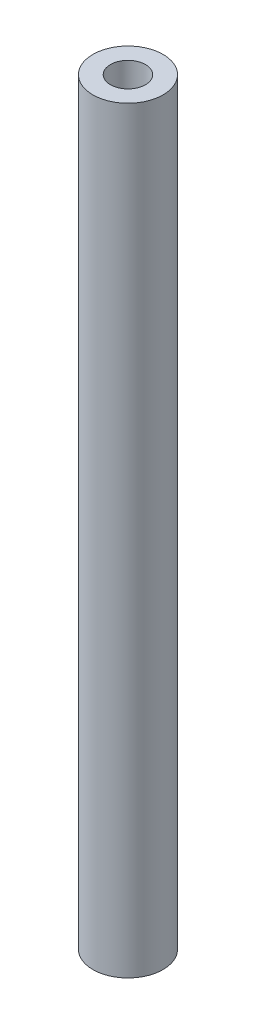
ISO-10303-21;
HEADER;
FILE_DESCRIPTION(('STEP AP214'),'2;1');
FILE_NAME('part.step','',(''),(''),'','','');
FILE_SCHEMA(('AUTOMOTIVE_DESIGN { 1 0 10303 214 1 1 1 1 }'));
ENDSEC;
DATA;
#1=APPLICATION_CONTEXT('core data for automotive mechanical design processes');
#2=APPLICATION_PROTOCOL_DEFINITION('international standard','automotive_design',2000,#1);
#3=PRODUCT_CONTEXT('',#1,'mechanical');
#4=PRODUCT('Part','Part','',(#3));
#5=PRODUCT_RELATED_PRODUCT_CATEGORY('part','',(#4));
#6=PRODUCT_DEFINITION_FORMATION('','',#4);
#7=PRODUCT_DEFINITION_CONTEXT('part definition',#1,'design');
#8=PRODUCT_DEFINITION('design','',#6,#7);
#9=PRODUCT_DEFINITION_SHAPE('','',#8);
#10=(LENGTH_UNIT() NAMED_UNIT(*) SI_UNIT(.MILLI.,.METRE.));
#11=(NAMED_UNIT(*) PLANE_ANGLE_UNIT() SI_UNIT($,.RADIAN.));
#12=(NAMED_UNIT(*) SI_UNIT($,.STERADIAN.) SOLID_ANGLE_UNIT());
#13=UNCERTAINTY_MEASURE_WITH_UNIT(LENGTH_MEASURE(1.E-05),#10,'distance_accuracy_value','');
#14=(GEOMETRIC_REPRESENTATION_CONTEXT(3) GLOBAL_UNCERTAINTY_ASSIGNED_CONTEXT((#13)) GLOBAL_UNIT_ASSIGNED_CONTEXT((#10,
#11,#12)) REPRESENTATION_CONTEXT('',''));
#15=CARTESIAN_POINT('',(0.,0.,0.));
#16=DIRECTION('',(0.,0.,1.));
#17=DIRECTION('',(1.,0.,0.));
#18=AXIS2_PLACEMENT_3D('',#15,#16,#17);
#19=CARTESIAN_POINT('',(0.,108.,0.));
#20=DIRECTION('',(0.,-1.,0.));
#21=DIRECTION('',(0.,0.,-1.));
#22=AXIS2_PLACEMENT_3D('',#19,#20,#21);
#23=CYLINDRICAL_SURFACE('',#22,5.);
#24=CARTESIAN_POINT('',(0.,108.,0.));
#25=DIRECTION('',(0.,1.,0.));
#26=DIRECTION('',(0.,0.,1.));
#27=AXIS2_PLACEMENT_3D('',#24,#25,#26);
#28=CIRCLE('',#27,5.);
#29=CARTESIAN_POINT('',(0.,108.,5.));
#30=VERTEX_POINT('',#29);
#31=EDGE_CURVE('E10',#30,#30,#28,.T.);
#32=ORIENTED_EDGE('',*,*,#31,.F.);
#33=EDGE_LOOP('',(#32));
#34=FACE_BOUND('',#33,.T.);
#35=CARTESIAN_POINT('',(0.,0.,0.));
#36=DIRECTION('',(0.,1.,0.));
#37=DIRECTION('',(0.,0.,1.));
#38=AXIS2_PLACEMENT_3D('',#35,#36,#37);
#39=CIRCLE('',#38,5.);
#40=CARTESIAN_POINT('',(0.,0.,5.));
#41=VERTEX_POINT('',#40);
#42=EDGE_CURVE('E47',#41,#41,#39,.T.);
#43=ORIENTED_EDGE('',*,*,#42,.T.);
#44=EDGE_LOOP('',(#43));
#45=FACE_BOUND('',#44,.T.);
#46=ADVANCED_FACE('F44',(#34,#45),#23,.T.);
#47=CARTESIAN_POINT('',(0.,108.,0.));
#48=DIRECTION('',(0.,1.,0.));
#49=DIRECTION('',(0.,0.,1.));
#50=AXIS2_PLACEMENT_3D('',#47,#48,#49);
#51=PLANE('',#50);
#52=CARTESIAN_POINT('',(0.,108.,0.));
#53=DIRECTION('',(0.,-1.,0.));
#54=DIRECTION('',(0.,0.,-1.));
#55=AXIS2_PLACEMENT_3D('',#52,#53,#54);
#56=CIRCLE('',#55,2.5);
#57=CARTESIAN_POINT('',(0.,108.,-2.5));
#58=VERTEX_POINT('',#57);
#59=EDGE_CURVE('E66',#58,#58,#56,.T.);
#60=ORIENTED_EDGE('',*,*,#59,.T.);
#61=EDGE_LOOP('',(#60));
#62=FACE_BOUND('',#61,.T.);
#63=ORIENTED_EDGE('',*,*,#31,.T.);
#64=EDGE_LOOP('',(#63));
#65=FACE_BOUND('',#64,.T.);
#66=ADVANCED_FACE('F86',(#62,#65),#51,.T.);
#67=CARTESIAN_POINT('',(0.,0.,0.));
#68=DIRECTION('',(0.,1.,0.));
#69=DIRECTION('',(0.,0.,1.));
#70=AXIS2_PLACEMENT_3D('',#67,#68,#69);
#71=PLANE('',#70);
#72=CARTESIAN_POINT('',(0.,0.,0.));
#73=DIRECTION('',(0.,-1.,0.));
#74=DIRECTION('',(0.,0.,-1.));
#75=AXIS2_PLACEMENT_3D('',#72,#73,#74);
#76=CIRCLE('',#75,2.5);
#77=CARTESIAN_POINT('',(0.,0.,-2.5));
#78=VERTEX_POINT('',#77);
#79=EDGE_CURVE('E58',#78,#78,#76,.T.);
#80=ORIENTED_EDGE('',*,*,#79,.F.);
#81=EDGE_LOOP('',(#80));
#82=FACE_BOUND('',#81,.T.);
#83=ORIENTED_EDGE('',*,*,#42,.F.);
#84=EDGE_LOOP('',(#83));
#85=FACE_BOUND('',#84,.T.);
#86=ADVANCED_FACE('F92',(#82,#85),#71,.F.);
#87=CARTESIAN_POINT('',(0.,10.,0.));
#88=DIRECTION('',(0.,-1.,0.));
#89=DIRECTION('',(0.,0.,-1.));
#90=AXIS2_PLACEMENT_3D('',#87,#88,#89);
#91=CYLINDRICAL_SURFACE('',#90,2.5);
#92=CARTESIAN_POINT('',(0.,10.,0.));
#93=DIRECTION('',(0.,-1.,0.));
#94=DIRECTION('',(0.,0.,-1.));
#95=AXIS2_PLACEMENT_3D('',#92,#93,#94);
#96=CIRCLE('',#95,2.5);
#97=CARTESIAN_POINT('',(0.,10.,-2.5));
#98=VERTEX_POINT('',#97);
#99=EDGE_CURVE('E56',#98,#98,#96,.T.);
#100=ORIENTED_EDGE('',*,*,#99,.F.);
#101=EDGE_LOOP('',(#100));
#102=FACE_BOUND('',#101,.T.);
#103=ORIENTED_EDGE('',*,*,#79,.T.);
#104=EDGE_LOOP('',(#103));
#105=FACE_BOUND('',#104,.T.);
#106=ADVANCED_FACE('F98',(#102,#105),#91,.F.);
#107=CARTESIAN_POINT('',(0.,10.,0.));
#108=DIRECTION('',(0.,-1.,0.));
#109=DIRECTION('',(0.,0.,-1.));
#110=AXIS2_PLACEMENT_3D('',#107,#108,#109);
#111=PLANE('',#110);
#112=ORIENTED_EDGE('',*,*,#99,.T.);
#113=EDGE_LOOP('',(#112));
#114=FACE_BOUND('',#113,.T.);
#115=ADVANCED_FACE('F83',(#114),#111,.T.);
#116=CARTESIAN_POINT('',(0.,98.,0.));
#117=DIRECTION('',(0.,1.,0.));
#118=DIRECTION('',(0.,0.,1.));
#119=AXIS2_PLACEMENT_3D('',#116,#117,#118);
#120=CYLINDRICAL_SURFACE('',#119,2.5);
#121=CARTESIAN_POINT('',(0.,98.,0.));
#122=DIRECTION('',(0.,-1.,0.));
#123=DIRECTION('',(0.,0.,-1.));
#124=AXIS2_PLACEMENT_3D('',#121,#122,#123);
#125=CIRCLE('',#124,2.5);
#126=CARTESIAN_POINT('',(0.,98.,-2.5));
#127=VERTEX_POINT('',#126);
#128=EDGE_CURVE('E62',#127,#127,#125,.T.);
#129=ORIENTED_EDGE('',*,*,#128,.T.);
#130=EDGE_LOOP('',(#129));
#131=FACE_BOUND('',#130,.T.);
#132=ORIENTED_EDGE('',*,*,#59,.F.);
#133=EDGE_LOOP('',(#132));
#134=FACE_BOUND('',#133,.T.);
#135=ADVANCED_FACE('F74',(#131,#134),#120,.F.);
#136=CARTESIAN_POINT('',(0.,98.,0.));
#137=DIRECTION('',(0.,1.,0.));
#138=DIRECTION('',(0.,0.,-1.));
#139=AXIS2_PLACEMENT_3D('',#136,#137,#138);
#140=PLANE('',#139);
#141=ORIENTED_EDGE('',*,*,#128,.F.);
#142=EDGE_LOOP('',(#141));
#143=FACE_BOUND('',#142,.T.);
#144=ADVANCED_FACE('F77',(#143),#140,.T.);
#145=CLOSED_SHELL('',(#46,#66,#86,#106,#115,#135,#144));
#146=MANIFOLD_SOLID_BREP('B2',#145);
#147=ADVANCED_BREP_SHAPE_REPRESENTATION('',(#18,#146),#14);
#148=SHAPE_DEFINITION_REPRESENTATION(#9,#147);
ENDSEC;
END-ISO-10303-21;
